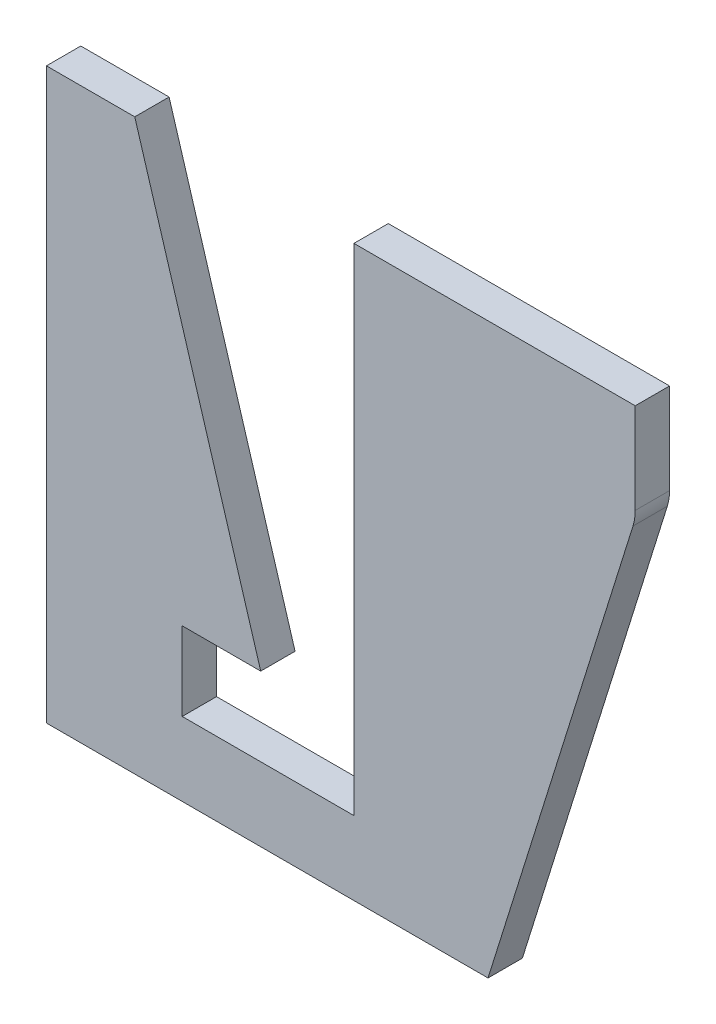
ISO-10303-21;
HEADER;
FILE_DESCRIPTION(('STEP AP214'),'2;1');
FILE_NAME('part.step','',(''),(''),'','','');
FILE_SCHEMA(('AUTOMOTIVE_DESIGN { 1 0 10303 214 1 1 1 1 }'));
ENDSEC;
DATA;
#1=APPLICATION_CONTEXT('core data for automotive mechanical design processes');
#2=APPLICATION_PROTOCOL_DEFINITION('international standard','automotive_design',2000,#1);
#3=PRODUCT_CONTEXT('',#1,'mechanical');
#4=PRODUCT('Part','Part','',(#3));
#5=PRODUCT_RELATED_PRODUCT_CATEGORY('part','',(#4));
#6=PRODUCT_DEFINITION_FORMATION('','',#4);
#7=PRODUCT_DEFINITION_CONTEXT('part definition',#1,'design');
#8=PRODUCT_DEFINITION('design','',#6,#7);
#9=PRODUCT_DEFINITION_SHAPE('','',#8);
#10=(LENGTH_UNIT() NAMED_UNIT(*) SI_UNIT(.MILLI.,.METRE.));
#11=(NAMED_UNIT(*) PLANE_ANGLE_UNIT() SI_UNIT($,.RADIAN.));
#12=(NAMED_UNIT(*) SI_UNIT($,.STERADIAN.) SOLID_ANGLE_UNIT());
#13=UNCERTAINTY_MEASURE_WITH_UNIT(LENGTH_MEASURE(1.E-05),#10,'distance_accuracy_value','');
#14=(GEOMETRIC_REPRESENTATION_CONTEXT(3) GLOBAL_UNCERTAINTY_ASSIGNED_CONTEXT((#13)) GLOBAL_UNIT_ASSIGNED_CONTEXT((#10,
#11,#12)) REPRESENTATION_CONTEXT('',''));
#15=CARTESIAN_POINT('',(0.,0.,0.));
#16=DIRECTION('',(0.,0.,1.));
#17=DIRECTION('',(1.,0.,0.));
#18=AXIS2_PLACEMENT_3D('',#15,#16,#17);
#19=CARTESIAN_POINT('',(-79.4884231212823,-55.1863271670526,7.));
#20=DIRECTION('',(1.,0.,0.));
#21=DIRECTION('',(0.,0.,-1.));
#22=AXIS2_PLACEMENT_3D('',#19,#20,#21);
#23=PLANE('',#22);
#24=DIRECTION('',(0.,-1.,0.));
#25=VECTOR('',#24,1.);
#26=CARTESIAN_POINT('',(-79.4884231212823,-55.1863271670526,0.));
#27=LINE('',#26,#25);
#28=CARTESIAN_POINT('',(-79.4884231212823,60.8136728329474,0.));
#29=VERTEX_POINT('',#28);
#30=CARTESIAN_POINT('',(-79.4884231212823,-55.1863271670526,0.));
#31=VERTEX_POINT('',#30);
#32=EDGE_CURVE('E151',#29,#31,#27,.T.);
#33=ORIENTED_EDGE('',*,*,#32,.T.);
#34=DIRECTION('',(0.,0.,-1.));
#35=VECTOR('',#34,1.);
#36=CARTESIAN_POINT('',(-79.4884231212823,-55.1863271670526,7.));
#37=LINE('',#36,#35);
#38=CARTESIAN_POINT('',(-79.4884231212823,-55.1863271670526,7.));
#39=VERTEX_POINT('',#38);
#40=EDGE_CURVE('E133',#39,#31,#37,.T.);
#41=ORIENTED_EDGE('',*,*,#40,.F.);
#42=DIRECTION('',(0.,-1.,0.));
#43=VECTOR('',#42,1.);
#44=CARTESIAN_POINT('',(-79.4884231212823,-55.1863271670526,7.));
#45=LINE('',#44,#43);
#46=CARTESIAN_POINT('',(-79.4884231212823,60.8136728329474,7.));
#47=VERTEX_POINT('',#46);
#48=EDGE_CURVE('E139',#47,#39,#45,.T.);
#49=ORIENTED_EDGE('',*,*,#48,.F.);
#50=DIRECTION('',(0.,0.,-1.));
#51=VECTOR('',#50,1.);
#52=CARTESIAN_POINT('',(-79.4884231212823,60.8136728329474,7.));
#53=LINE('',#52,#51);
#54=EDGE_CURVE('E180',#47,#29,#53,.T.);
#55=ORIENTED_EDGE('',*,*,#54,.T.);
#56=EDGE_LOOP('',(#33,#41,#49,#55));
#57=FACE_BOUND('',#56,.T.);
#58=ADVANCED_FACE('F40',(#57),#23,.F.);
#59=CARTESIAN_POINT('',(10.5115768787177,-55.1863271670526,7.));
#60=DIRECTION('',(0.,1.,0.));
#61=DIRECTION('',(-1.,0.,0.));
#62=AXIS2_PLACEMENT_3D('',#59,#60,#61);
#63=PLANE('',#62);
#64=DIRECTION('',(1.,0.,0.));
#65=VECTOR('',#64,1.);
#66=CARTESIAN_POINT('',(10.5115768787177,-55.1863271670526,0.));
#67=LINE('',#66,#65);
#68=CARTESIAN_POINT('',(10.5115768787177,-55.1863271670526,0.));
#69=VERTEX_POINT('',#68);
#70=EDGE_CURVE('E199',#31,#69,#67,.T.);
#71=ORIENTED_EDGE('',*,*,#70,.T.);
#72=DIRECTION('',(0.,0.,-1.));
#73=VECTOR('',#72,1.);
#74=CARTESIAN_POINT('',(10.5115768787177,-55.1863271670526,7.));
#75=LINE('',#74,#73);
#76=CARTESIAN_POINT('',(10.5115768787177,-55.1863271670526,7.));
#77=VERTEX_POINT('',#76);
#78=EDGE_CURVE('E136',#77,#69,#75,.T.);
#79=ORIENTED_EDGE('',*,*,#78,.F.);
#80=DIRECTION('',(1.,0.,0.));
#81=VECTOR('',#80,1.);
#82=CARTESIAN_POINT('',(10.5115768787177,-55.1863271670526,7.));
#83=LINE('',#82,#81);
#84=EDGE_CURVE('E129',#39,#77,#83,.T.);
#85=ORIENTED_EDGE('',*,*,#84,.F.);
#86=ORIENTED_EDGE('',*,*,#40,.T.);
#87=EDGE_LOOP('',(#71,#79,#85,#86));
#88=FACE_BOUND('',#87,.T.);
#89=ADVANCED_FACE('F131',(#88),#63,.F.);
#90=CARTESIAN_POINT('',(40.5115768787177,40.8136728329474,7.));
#91=DIRECTION('',(-0.95447997803503,0.298274993135947,0.));
#92=DIRECTION('',(-0.298274993135947,-0.95447997803503,0.));
#93=AXIS2_PLACEMENT_3D('',#90,#91,#92);
#94=PLANE('',#93);
#95=DIRECTION('',(0.298274993135947,0.95447997803503,0.));
#96=VECTOR('',#95,1.);
#97=CARTESIAN_POINT('',(40.5115768787177,40.8136728329474,0.));
#98=LINE('',#97,#96);
#99=CARTESIAN_POINT('',(40.056376659068,39.3570321300683,0.));
#100=VERTEX_POINT('',#99);
#101=EDGE_CURVE('E197',#69,#100,#98,.T.);
#102=ORIENTED_EDGE('',*,*,#101,.T.);
#103=DIRECTION('',(0.,0.,-1.));
#104=VECTOR('',#103,1.);
#105=CARTESIAN_POINT('',(40.056376659068,39.3570321300683,7.));
#106=LINE('',#105,#104);
#107=CARTESIAN_POINT('',(40.056376659068,39.3570321300683,7.));
#108=VERTEX_POINT('',#107);
#109=EDGE_CURVE('E48',#100,#108,#106,.F.);
#110=ORIENTED_EDGE('',*,*,#109,.T.);
#111=DIRECTION('',(0.298274993135947,0.95447997803503,0.));
#112=VECTOR('',#111,1.);
#113=CARTESIAN_POINT('',(40.5115768787177,40.8136728329474,7.));
#114=LINE('',#113,#112);
#115=EDGE_CURVE('E138',#77,#108,#114,.T.);
#116=ORIENTED_EDGE('',*,*,#115,.F.);
#117=ORIENTED_EDGE('',*,*,#78,.T.);
#118=EDGE_LOOP('',(#102,#110,#116,#117));
#119=FACE_BOUND('',#118,.T.);
#120=ADVANCED_FACE('F258',(#119),#94,.F.);
#121=CARTESIAN_POINT('',(40.5115768787177,60.8136728329474,7.));
#122=DIRECTION('',(-1.,0.,0.));
#123=DIRECTION('',(0.,-1.,0.));
#124=AXIS2_PLACEMENT_3D('',#121,#122,#123);
#125=PLANE('',#124);
#126=DIRECTION('',(0.,1.,0.));
#127=VECTOR('',#126,1.);
#128=CARTESIAN_POINT('',(40.5115768787177,60.8136728329474,7.));
#129=LINE('',#128,#127);
#130=CARTESIAN_POINT('',(40.5115768787177,42.3397820614278,7.));
#131=VERTEX_POINT('',#130);
#132=CARTESIAN_POINT('',(40.5115768787177,60.8136728329474,7.));
#133=VERTEX_POINT('',#132);
#134=EDGE_CURVE('E215',#131,#133,#129,.T.);
#135=ORIENTED_EDGE('',*,*,#134,.F.);
#136=DIRECTION('',(0.,0.,-1.));
#137=VECTOR('',#136,1.);
#138=CARTESIAN_POINT('',(40.5115768787177,42.3397820614278,7.));
#139=LINE('',#138,#137);
#140=CARTESIAN_POINT('',(40.5115768787177,42.3397820614278,0.));
#141=VERTEX_POINT('',#140);
#142=EDGE_CURVE('E152',#131,#141,#139,.T.);
#143=ORIENTED_EDGE('',*,*,#142,.T.);
#144=DIRECTION('',(0.,1.,0.));
#145=VECTOR('',#144,1.);
#146=CARTESIAN_POINT('',(40.5115768787177,60.8136728329474,0.));
#147=LINE('',#146,#145);
#148=CARTESIAN_POINT('',(40.5115768787177,60.8136728329474,0.));
#149=VERTEX_POINT('',#148);
#150=EDGE_CURVE('E195',#141,#149,#147,.T.);
#151=ORIENTED_EDGE('',*,*,#150,.T.);
#152=DIRECTION('',(0.,0.,-1.));
#153=VECTOR('',#152,1.);
#154=CARTESIAN_POINT('',(40.5115768787177,60.8136728329474,7.));
#155=LINE('',#154,#153);
#156=EDGE_CURVE('E156',#133,#149,#155,.T.);
#157=ORIENTED_EDGE('',*,*,#156,.F.);
#158=EDGE_LOOP('',(#135,#143,#151,#157));
#159=FACE_BOUND('',#158,.T.);
#160=ADVANCED_FACE('F222',(#159),#125,.F.);
#161=CARTESIAN_POINT('',(-16.8162919737414,60.8136728329474,7.));
#162=DIRECTION('',(0.,-1.,0.));
#163=DIRECTION('',(0.,0.,-1.));
#164=AXIS2_PLACEMENT_3D('',#161,#162,#163);
#165=PLANE('',#164);
#166=DIRECTION('',(-1.,0.,0.));
#167=VECTOR('',#166,1.);
#168=CARTESIAN_POINT('',(-16.8162919737414,60.8136728329474,0.));
#169=LINE('',#168,#167);
#170=CARTESIAN_POINT('',(-16.8162919737414,60.8136728329474,0.));
#171=VERTEX_POINT('',#170);
#172=EDGE_CURVE('E193',#149,#171,#169,.T.);
#173=ORIENTED_EDGE('',*,*,#172,.T.);
#174=DIRECTION('',(0.,0.,-1.));
#175=VECTOR('',#174,1.);
#176=CARTESIAN_POINT('',(-16.8162919737414,60.8136728329474,7.));
#177=LINE('',#176,#175);
#178=CARTESIAN_POINT('',(-16.8162919737414,60.8136728329474,7.));
#179=VERTEX_POINT('',#178);
#180=EDGE_CURVE('E162',#179,#171,#177,.T.);
#181=ORIENTED_EDGE('',*,*,#180,.F.);
#182=DIRECTION('',(-1.,0.,0.));
#183=VECTOR('',#182,1.);
#184=CARTESIAN_POINT('',(-16.8162919737414,60.8136728329474,7.));
#185=LINE('',#184,#183);
#186=EDGE_CURVE('E213',#133,#179,#185,.T.);
#187=ORIENTED_EDGE('',*,*,#186,.F.);
#188=ORIENTED_EDGE('',*,*,#156,.T.);
#189=EDGE_LOOP('',(#173,#181,#187,#188));
#190=FACE_BOUND('',#189,.T.);
#191=ADVANCED_FACE('F230',(#190),#165,.F.);
#192=CARTESIAN_POINT('',(-16.8162919737414,-40.1863271670526,7.));
#193=DIRECTION('',(1.,0.,0.));
#194=DIRECTION('',(0.,0.,-1.));
#195=AXIS2_PLACEMENT_3D('',#192,#193,#194);
#196=PLANE('',#195);
#197=DIRECTION('',(0.,-1.,0.));
#198=VECTOR('',#197,1.);
#199=CARTESIAN_POINT('',(-16.8162919737414,-40.1863271670526,0.));
#200=LINE('',#199,#198);
#201=CARTESIAN_POINT('',(-16.8162919737414,-40.1863271670526,0.));
#202=VERTEX_POINT('',#201);
#203=EDGE_CURVE('E191',#171,#202,#200,.T.);
#204=ORIENTED_EDGE('',*,*,#203,.T.);
#205=DIRECTION('',(0.,0.,-1.));
#206=VECTOR('',#205,1.);
#207=CARTESIAN_POINT('',(-16.8162919737414,-40.1863271670526,7.));
#208=LINE('',#207,#206);
#209=CARTESIAN_POINT('',(-16.8162919737414,-40.1863271670526,7.));
#210=VERTEX_POINT('',#209);
#211=EDGE_CURVE('E165',#210,#202,#208,.T.);
#212=ORIENTED_EDGE('',*,*,#211,.F.);
#213=DIRECTION('',(0.,-1.,0.));
#214=VECTOR('',#213,1.);
#215=CARTESIAN_POINT('',(-16.8162919737414,-40.1863271670526,7.));
#216=LINE('',#215,#214);
#217=EDGE_CURVE('E211',#179,#210,#216,.T.);
#218=ORIENTED_EDGE('',*,*,#217,.F.);
#219=ORIENTED_EDGE('',*,*,#180,.T.);
#220=EDGE_LOOP('',(#204,#212,#218,#219));
#221=FACE_BOUND('',#220,.T.);
#222=ADVANCED_FACE('F234',(#221),#196,.F.);
#223=CARTESIAN_POINT('',(-51.8162919737414,-40.1863271670526,7.));
#224=DIRECTION('',(0.,-1.,0.));
#225=DIRECTION('',(0.,0.,-1.));
#226=AXIS2_PLACEMENT_3D('',#223,#224,#225);
#227=PLANE('',#226);
#228=DIRECTION('',(-1.,0.,0.));
#229=VECTOR('',#228,1.);
#230=CARTESIAN_POINT('',(-51.8162919737414,-40.1863271670526,0.));
#231=LINE('',#230,#229);
#232=CARTESIAN_POINT('',(-51.8162919737414,-40.1863271670526,0.));
#233=VERTEX_POINT('',#232);
#234=EDGE_CURVE('E189',#202,#233,#231,.T.);
#235=ORIENTED_EDGE('',*,*,#234,.T.);
#236=DIRECTION('',(0.,0.,-1.));
#237=VECTOR('',#236,1.);
#238=CARTESIAN_POINT('',(-51.8162919737414,-40.1863271670526,7.));
#239=LINE('',#238,#237);
#240=CARTESIAN_POINT('',(-51.8162919737414,-40.1863271670526,7.));
#241=VERTEX_POINT('',#240);
#242=EDGE_CURVE('E168',#241,#233,#239,.T.);
#243=ORIENTED_EDGE('',*,*,#242,.F.);
#244=DIRECTION('',(-1.,0.,0.));
#245=VECTOR('',#244,1.);
#246=CARTESIAN_POINT('',(-51.8162919737414,-40.1863271670526,7.));
#247=LINE('',#246,#245);
#248=EDGE_CURVE('E209',#210,#241,#247,.T.);
#249=ORIENTED_EDGE('',*,*,#248,.F.);
#250=ORIENTED_EDGE('',*,*,#211,.T.);
#251=EDGE_LOOP('',(#235,#243,#249,#250));
#252=FACE_BOUND('',#251,.T.);
#253=ADVANCED_FACE('F241',(#252),#227,.F.);
#254=CARTESIAN_POINT('',(-51.8162919737414,-24.1863271670526,7.));
#255=DIRECTION('',(-1.,0.,0.));
#256=DIRECTION('',(0.,0.,1.));
#257=AXIS2_PLACEMENT_3D('',#254,#255,#256);
#258=PLANE('',#257);
#259=DIRECTION('',(0.,1.,0.));
#260=VECTOR('',#259,1.);
#261=CARTESIAN_POINT('',(-51.8162919737414,-24.1863271670526,0.));
#262=LINE('',#261,#260);
#263=CARTESIAN_POINT('',(-51.8162919737414,-24.1863271670526,0.));
#264=VERTEX_POINT('',#263);
#265=EDGE_CURVE('E187',#233,#264,#262,.T.);
#266=ORIENTED_EDGE('',*,*,#265,.T.);
#267=DIRECTION('',(0.,0.,-1.));
#268=VECTOR('',#267,1.);
#269=CARTESIAN_POINT('',(-51.8162919737414,-24.1863271670526,7.));
#270=LINE('',#269,#268);
#271=CARTESIAN_POINT('',(-51.8162919737414,-24.1863271670526,7.));
#272=VERTEX_POINT('',#271);
#273=EDGE_CURVE('E171',#272,#264,#270,.T.);
#274=ORIENTED_EDGE('',*,*,#273,.F.);
#275=DIRECTION('',(0.,1.,0.));
#276=VECTOR('',#275,1.);
#277=CARTESIAN_POINT('',(-51.8162919737414,-24.1863271670526,7.));
#278=LINE('',#277,#276);
#279=EDGE_CURVE('E207',#241,#272,#278,.T.);
#280=ORIENTED_EDGE('',*,*,#279,.F.);
#281=ORIENTED_EDGE('',*,*,#242,.T.);
#282=EDGE_LOOP('',(#266,#274,#280,#281));
#283=FACE_BOUND('',#282,.T.);
#284=ADVANCED_FACE('F244',(#283),#258,.F.);
#285=CARTESIAN_POINT('',(-35.8162919737414,-24.1863271670526,7.));
#286=DIRECTION('',(0.,1.,0.));
#287=DIRECTION('',(0.,0.,1.));
#288=AXIS2_PLACEMENT_3D('',#285,#286,#287);
#289=PLANE('',#288);
#290=DIRECTION('',(1.,0.,0.));
#291=VECTOR('',#290,1.);
#292=CARTESIAN_POINT('',(-35.8162919737414,-24.1863271670526,0.));
#293=LINE('',#292,#291);
#294=CARTESIAN_POINT('',(-35.8162919737414,-24.1863271670526,0.));
#295=VERTEX_POINT('',#294);
#296=EDGE_CURVE('E185',#264,#295,#293,.T.);
#297=ORIENTED_EDGE('',*,*,#296,.T.);
#298=DIRECTION('',(0.,0.,-1.));
#299=VECTOR('',#298,1.);
#300=CARTESIAN_POINT('',(-35.8162919737414,-24.1863271670526,7.));
#301=LINE('',#300,#299);
#302=CARTESIAN_POINT('',(-35.8162919737414,-24.1863271670526,7.));
#303=VERTEX_POINT('',#302);
#304=EDGE_CURVE('E174',#303,#295,#301,.T.);
#305=ORIENTED_EDGE('',*,*,#304,.F.);
#306=DIRECTION('',(1.,0.,0.));
#307=VECTOR('',#306,1.);
#308=CARTESIAN_POINT('',(-35.8162919737414,-24.1863271670526,7.));
#309=LINE('',#308,#307);
#310=EDGE_CURVE('E205',#272,#303,#309,.T.);
#311=ORIENTED_EDGE('',*,*,#310,.F.);
#312=ORIENTED_EDGE('',*,*,#273,.T.);
#313=EDGE_LOOP('',(#297,#305,#311,#312));
#314=FACE_BOUND('',#313,.T.);
#315=ADVANCED_FACE('F249',(#314),#289,.F.);
#316=CARTESIAN_POINT('',(-61.4884231212823,60.8136728329474,7.));
#317=DIRECTION('',(-0.957291078882459,-0.289125907334605,0.));
#318=DIRECTION('',(0.289125907334605,-0.957291078882459,0.));
#319=AXIS2_PLACEMENT_3D('',#316,#317,#318);
#320=PLANE('',#319);
#321=DIRECTION('',(-0.289125907334605,0.957291078882458,0.));
#322=VECTOR('',#321,1.);
#323=CARTESIAN_POINT('',(-61.4884231212823,60.8136728329474,0.));
#324=LINE('',#323,#322);
#325=CARTESIAN_POINT('',(-61.4884231212823,60.8136728329474,0.));
#326=VERTEX_POINT('',#325);
#327=EDGE_CURVE('E183',#295,#326,#324,.T.);
#328=ORIENTED_EDGE('',*,*,#327,.T.);
#329=DIRECTION('',(0.,0.,-1.));
#330=VECTOR('',#329,1.);
#331=CARTESIAN_POINT('',(-61.4884231212823,60.8136728329474,7.));
#332=LINE('',#331,#330);
#333=CARTESIAN_POINT('',(-61.4884231212823,60.8136728329474,7.));
#334=VERTEX_POINT('',#333);
#335=EDGE_CURVE('E177',#334,#326,#332,.T.);
#336=ORIENTED_EDGE('',*,*,#335,.F.);
#337=DIRECTION('',(-0.289125907334605,0.957291078882458,0.));
#338=VECTOR('',#337,1.);
#339=CARTESIAN_POINT('',(-61.4884231212823,60.8136728329474,7.));
#340=LINE('',#339,#338);
#341=EDGE_CURVE('E203',#303,#334,#340,.T.);
#342=ORIENTED_EDGE('',*,*,#341,.F.);
#343=ORIENTED_EDGE('',*,*,#304,.T.);
#344=EDGE_LOOP('',(#328,#336,#342,#343));
#345=FACE_BOUND('',#344,.T.);
#346=ADVANCED_FACE('F253',(#345),#320,.F.);
#347=CARTESIAN_POINT('',(-79.4884231212823,60.8136728329474,7.));
#348=DIRECTION('',(0.,-1.,0.));
#349=DIRECTION('',(0.,0.,-1.));
#350=AXIS2_PLACEMENT_3D('',#347,#348,#349);
#351=PLANE('',#350);
#352=DIRECTION('',(-1.,0.,0.));
#353=VECTOR('',#352,1.);
#354=CARTESIAN_POINT('',(-79.4884231212823,60.8136728329474,0.));
#355=LINE('',#354,#353);
#356=EDGE_CURVE('E148',#326,#29,#355,.T.);
#357=ORIENTED_EDGE('',*,*,#356,.T.);
#358=ORIENTED_EDGE('',*,*,#54,.F.);
#359=DIRECTION('',(-1.,0.,0.));
#360=VECTOR('',#359,1.);
#361=CARTESIAN_POINT('',(-79.4884231212823,60.8136728329474,7.));
#362=LINE('',#361,#360);
#363=EDGE_CURVE('E144',#334,#47,#362,.T.);
#364=ORIENTED_EDGE('',*,*,#363,.F.);
#365=ORIENTED_EDGE('',*,*,#335,.T.);
#366=EDGE_LOOP('',(#357,#358,#364,#365));
#367=FACE_BOUND('',#366,.T.);
#368=ADVANCED_FACE('F257',(#367),#351,.F.);
#369=CARTESIAN_POINT('',(0.,0.,7.));
#370=DIRECTION('',(0.,0.,-1.));
#371=DIRECTION('',(-1.,0.,0.));
#372=AXIS2_PLACEMENT_3D('',#369,#370,#371);
#373=PLANE('',#372);
#374=ORIENTED_EDGE('',*,*,#115,.T.);
#375=CARTESIAN_POINT('',(30.5115768787177,42.3397820614278,7.));
#376=DIRECTION('',(0.,0.,-1.));
#377=DIRECTION('',(-1.,0.,0.));
#378=AXIS2_PLACEMENT_3D('',#375,#376,#377);
#379=CIRCLE('',#378,10.);
#380=EDGE_CURVE('E11',#108,#131,#379,.F.);
#381=ORIENTED_EDGE('',*,*,#380,.T.);
#382=ORIENTED_EDGE('',*,*,#134,.T.);
#383=ORIENTED_EDGE('',*,*,#186,.T.);
#384=ORIENTED_EDGE('',*,*,#217,.T.);
#385=ORIENTED_EDGE('',*,*,#248,.T.);
#386=ORIENTED_EDGE('',*,*,#279,.T.);
#387=ORIENTED_EDGE('',*,*,#310,.T.);
#388=ORIENTED_EDGE('',*,*,#341,.T.);
#389=ORIENTED_EDGE('',*,*,#363,.T.);
#390=ORIENTED_EDGE('',*,*,#48,.T.);
#391=ORIENTED_EDGE('',*,*,#84,.T.);
#392=EDGE_LOOP('',(#374,#381,#382,#383,#384,#385,#386,#387,#388,#389,#390,#391));
#393=FACE_BOUND('',#392,.T.);
#394=ADVANCED_FACE('F142',(#393),#373,.F.);
#395=CARTESIAN_POINT('',(0.,0.,0.));
#396=DIRECTION('',(0.,0.,-1.));
#397=DIRECTION('',(-1.,0.,0.));
#398=AXIS2_PLACEMENT_3D('',#395,#396,#397);
#399=PLANE('',#398);
#400=ORIENTED_EDGE('',*,*,#150,.F.);
#401=CARTESIAN_POINT('',(30.5115768787177,42.3397820614278,0.));
#402=DIRECTION('',(0.,0.,-1.));
#403=DIRECTION('',(-1.,0.,0.));
#404=AXIS2_PLACEMENT_3D('',#401,#402,#403);
#405=CIRCLE('',#404,10.);
#406=EDGE_CURVE('E62',#141,#100,#405,.T.);
#407=ORIENTED_EDGE('',*,*,#406,.T.);
#408=ORIENTED_EDGE('',*,*,#101,.F.);
#409=ORIENTED_EDGE('',*,*,#70,.F.);
#410=ORIENTED_EDGE('',*,*,#32,.F.);
#411=ORIENTED_EDGE('',*,*,#356,.F.);
#412=ORIENTED_EDGE('',*,*,#327,.F.);
#413=ORIENTED_EDGE('',*,*,#296,.F.);
#414=ORIENTED_EDGE('',*,*,#265,.F.);
#415=ORIENTED_EDGE('',*,*,#234,.F.);
#416=ORIENTED_EDGE('',*,*,#203,.F.);
#417=ORIENTED_EDGE('',*,*,#172,.F.);
#418=EDGE_LOOP('',(#400,#407,#408,#409,#410,#411,#412,#413,#414,#415,#416,#417));
#419=FACE_BOUND('',#418,.T.);
#420=ADVANCED_FACE('F225',(#419),#399,.T.);
#421=CARTESIAN_POINT('',(30.5115768787177,42.3397820614278,7.));
#422=DIRECTION('',(0.,0.,-1.));
#423=DIRECTION('',(-1.,0.,0.));
#424=AXIS2_PLACEMENT_3D('',#421,#422,#423);
#425=CYLINDRICAL_SURFACE('',#424,10.);
#426=ORIENTED_EDGE('',*,*,#380,.F.);
#427=ORIENTED_EDGE('',*,*,#109,.F.);
#428=ORIENTED_EDGE('',*,*,#406,.F.);
#429=ORIENTED_EDGE('',*,*,#142,.F.);
#430=EDGE_LOOP('',(#426,#427,#428,#429));
#431=FACE_BOUND('',#430,.T.);
#432=ADVANCED_FACE('F42',(#431),#425,.T.);
#433=CLOSED_SHELL('',(#58,#89,#120,#160,#191,#222,#253,#284,#315,#346,#368,#394,#420,#432));
#434=MANIFOLD_SOLID_BREP('B2',#433);
#435=ADVANCED_BREP_SHAPE_REPRESENTATION('',(#18,#434),#14);
#436=SHAPE_DEFINITION_REPRESENTATION(#9,#435);
ENDSEC;
END-ISO-10303-21;
